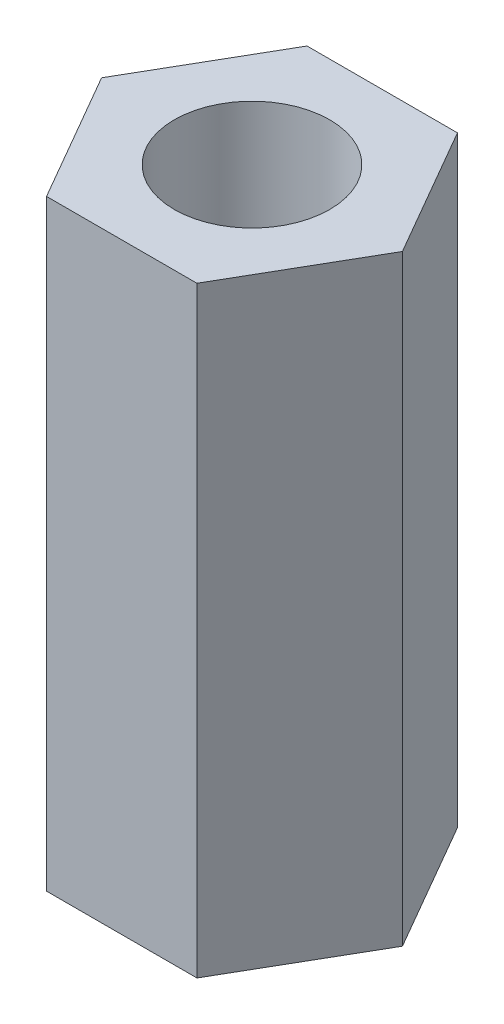
ISO-10303-21;
HEADER;
FILE_DESCRIPTION(('STEP AP214'),'2;1');
FILE_NAME('part.step','',(''),(''),'','','');
FILE_SCHEMA(('AUTOMOTIVE_DESIGN { 1 0 10303 214 1 1 1 1 }'));
ENDSEC;
DATA;
#1=APPLICATION_CONTEXT('core data for automotive mechanical design processes');
#2=APPLICATION_PROTOCOL_DEFINITION('international standard','automotive_design',2000,#1);
#3=PRODUCT_CONTEXT('',#1,'mechanical');
#4=PRODUCT('Part','Part','',(#3));
#5=PRODUCT_RELATED_PRODUCT_CATEGORY('part','',(#4));
#6=PRODUCT_DEFINITION_FORMATION('','',#4);
#7=PRODUCT_DEFINITION_CONTEXT('part definition',#1,'design');
#8=PRODUCT_DEFINITION('design','',#6,#7);
#9=PRODUCT_DEFINITION_SHAPE('','',#8);
#10=(LENGTH_UNIT() NAMED_UNIT(*) SI_UNIT(.MILLI.,.METRE.));
#11=(NAMED_UNIT(*) PLANE_ANGLE_UNIT() SI_UNIT($,.RADIAN.));
#12=(NAMED_UNIT(*) SI_UNIT($,.STERADIAN.) SOLID_ANGLE_UNIT());
#13=UNCERTAINTY_MEASURE_WITH_UNIT(LENGTH_MEASURE(1.E-05),#10,'distance_accuracy_value','');
#14=(GEOMETRIC_REPRESENTATION_CONTEXT(3) GLOBAL_UNCERTAINTY_ASSIGNED_CONTEXT((#13)) GLOBAL_UNIT_ASSIGNED_CONTEXT((#10,
#11,#12)) REPRESENTATION_CONTEXT('',''));
#15=CARTESIAN_POINT('',(0.,0.,0.));
#16=DIRECTION('',(0.,0.,1.));
#17=DIRECTION('',(1.,0.,0.));
#18=AXIS2_PLACEMENT_3D('',#15,#16,#17);
#19=CARTESIAN_POINT('',(1.25000000000002,10.,2.16506350946108));
#20=DIRECTION('',(-0.866025403784442,0.,-0.499999999999995));
#21=DIRECTION('',(-0.499999999999995,0.,0.866025403784442));
#22=AXIS2_PLACEMENT_3D('',#19,#20,#21);
#23=PLANE('',#22);
#24=DIRECTION('',(0.499999999999995,0.,-0.866025403784441));
#25=VECTOR('',#24,1.);
#26=CARTESIAN_POINT('',(1.25000000000002,0.,2.16506350946108));
#27=LINE('',#26,#25);
#28=CARTESIAN_POINT('',(1.25000000000002,0.,2.16506350946108));
#29=VERTEX_POINT('',#28);
#30=CARTESIAN_POINT('',(2.5,0.,0.));
#31=VERTEX_POINT('',#30);
#32=EDGE_CURVE('E116',#29,#31,#27,.T.);
#33=ORIENTED_EDGE('',*,*,#32,.T.);
#34=DIRECTION('',(0.,-1.,0.));
#35=VECTOR('',#34,1.);
#36=CARTESIAN_POINT('',(2.5,10.,0.));
#37=LINE('',#36,#35);
#38=CARTESIAN_POINT('',(2.5,10.,0.));
#39=VERTEX_POINT('',#38);
#40=EDGE_CURVE('E11',#39,#31,#37,.T.);
#41=ORIENTED_EDGE('',*,*,#40,.F.);
#42=DIRECTION('',(0.499999999999995,0.,-0.866025403784441));
#43=VECTOR('',#42,1.);
#44=CARTESIAN_POINT('',(1.25000000000002,10.,2.16506350946108));
#45=LINE('',#44,#43);
#46=CARTESIAN_POINT('',(1.25000000000002,10.,2.16506350946108));
#47=VERTEX_POINT('',#46);
#48=EDGE_CURVE('E127',#47,#39,#45,.T.);
#49=ORIENTED_EDGE('',*,*,#48,.F.);
#50=DIRECTION('',(0.,-1.,0.));
#51=VECTOR('',#50,1.);
#52=CARTESIAN_POINT('',(1.25000000000002,10.,2.16506350946108));
#53=LINE('',#52,#51);
#54=EDGE_CURVE('E112',#47,#29,#53,.T.);
#55=ORIENTED_EDGE('',*,*,#54,.T.);
#56=EDGE_LOOP('',(#33,#41,#49,#55));
#57=FACE_BOUND('',#56,.T.);
#58=ADVANCED_FACE('F32',(#57),#23,.F.);
#59=CARTESIAN_POINT('',(2.5,10.,0.));
#60=DIRECTION('',(-0.866025403784438,0.,0.500000000000001));
#61=DIRECTION('',(0.500000000000001,0.,0.866025403784438));
#62=AXIS2_PLACEMENT_3D('',#59,#60,#61);
#63=PLANE('',#62);
#64=DIRECTION('',(-0.500000000000001,0.,-0.866025403784438));
#65=VECTOR('',#64,1.);
#66=CARTESIAN_POINT('',(2.5,0.,0.));
#67=LINE('',#66,#65);
#68=CARTESIAN_POINT('',(1.24999999999999,0.,-2.1650635094611));
#69=VERTEX_POINT('',#68);
#70=EDGE_CURVE('E119',#31,#69,#67,.T.);
#71=ORIENTED_EDGE('',*,*,#70,.T.);
#72=DIRECTION('',(0.,-1.,0.));
#73=VECTOR('',#72,1.);
#74=CARTESIAN_POINT('',(1.24999999999999,10.,-2.1650635094611));
#75=LINE('',#74,#73);
#76=CARTESIAN_POINT('',(1.24999999999999,10.,-2.1650635094611));
#77=VERTEX_POINT('',#76);
#78=EDGE_CURVE('E40',#77,#69,#75,.T.);
#79=ORIENTED_EDGE('',*,*,#78,.F.);
#80=DIRECTION('',(-0.500000000000001,0.,-0.866025403784438));
#81=VECTOR('',#80,1.);
#82=CARTESIAN_POINT('',(2.5,10.,0.));
#83=LINE('',#82,#81);
#84=EDGE_CURVE('E85',#39,#77,#83,.T.);
#85=ORIENTED_EDGE('',*,*,#84,.F.);
#86=ORIENTED_EDGE('',*,*,#40,.T.);
#87=EDGE_LOOP('',(#71,#79,#85,#86));
#88=FACE_BOUND('',#87,.T.);
#89=ADVANCED_FACE('F152',(#88),#63,.F.);
#90=CARTESIAN_POINT('',(1.24999999999999,10.,-2.1650635094611));
#91=DIRECTION('',(0.,0.,1.));
#92=DIRECTION('',(1.,0.,0.));
#93=AXIS2_PLACEMENT_3D('',#90,#91,#92);
#94=PLANE('',#93);
#95=DIRECTION('',(-1.,0.,0.));
#96=VECTOR('',#95,1.);
#97=CARTESIAN_POINT('',(1.24999999999999,0.,-2.1650635094611));
#98=LINE('',#97,#96);
#99=CARTESIAN_POINT('',(-1.25000000000001,0.,-2.16506350946109));
#100=VERTEX_POINT('',#99);
#101=EDGE_CURVE('E122',#69,#100,#98,.T.);
#102=ORIENTED_EDGE('',*,*,#101,.T.);
#103=DIRECTION('',(0.,-1.,0.));
#104=VECTOR('',#103,1.);
#105=CARTESIAN_POINT('',(-1.25000000000001,10.,-2.16506350946109));
#106=LINE('',#105,#104);
#107=CARTESIAN_POINT('',(-1.25000000000001,10.,-2.16506350946109));
#108=VERTEX_POINT('',#107);
#109=EDGE_CURVE('E107',#108,#100,#106,.T.);
#110=ORIENTED_EDGE('',*,*,#109,.F.);
#111=DIRECTION('',(-1.,0.,0.));
#112=VECTOR('',#111,1.);
#113=CARTESIAN_POINT('',(1.24999999999999,10.,-2.1650635094611));
#114=LINE('',#113,#112);
#115=EDGE_CURVE('E98',#77,#108,#114,.T.);
#116=ORIENTED_EDGE('',*,*,#115,.F.);
#117=ORIENTED_EDGE('',*,*,#78,.T.);
#118=EDGE_LOOP('',(#102,#110,#116,#117));
#119=FACE_BOUND('',#118,.T.);
#120=ADVANCED_FACE('F133',(#119),#94,.F.);
#121=CARTESIAN_POINT('',(-1.25000000000001,10.,-2.16506350946109));
#122=DIRECTION('',(0.866025403784441,0.,0.499999999999995));
#123=DIRECTION('',(0.499999999999995,0.,-0.866025403784441));
#124=AXIS2_PLACEMENT_3D('',#121,#122,#123);
#125=PLANE('',#124);
#126=DIRECTION('',(-0.499999999999995,0.,0.866025403784441));
#127=VECTOR('',#126,1.);
#128=CARTESIAN_POINT('',(-1.25000000000001,0.,-2.16506350946109));
#129=LINE('',#128,#127);
#130=CARTESIAN_POINT('',(-2.5,0.,0.));
#131=VERTEX_POINT('',#130);
#132=EDGE_CURVE('E106',#100,#131,#129,.T.);
#133=ORIENTED_EDGE('',*,*,#132,.T.);
#134=DIRECTION('',(0.,-1.,0.));
#135=VECTOR('',#134,1.);
#136=CARTESIAN_POINT('',(-2.5,10.,0.));
#137=LINE('',#136,#135);
#138=CARTESIAN_POINT('',(-2.5,10.,0.));
#139=VERTEX_POINT('',#138);
#140=EDGE_CURVE('E103',#139,#131,#137,.T.);
#141=ORIENTED_EDGE('',*,*,#140,.F.);
#142=DIRECTION('',(-0.499999999999995,0.,0.866025403784441));
#143=VECTOR('',#142,1.);
#144=CARTESIAN_POINT('',(-1.25000000000001,10.,-2.16506350946109));
#145=LINE('',#144,#143);
#146=EDGE_CURVE('E92',#108,#139,#145,.T.);
#147=ORIENTED_EDGE('',*,*,#146,.F.);
#148=ORIENTED_EDGE('',*,*,#109,.T.);
#149=EDGE_LOOP('',(#133,#141,#147,#148));
#150=FACE_BOUND('',#149,.T.);
#151=ADVANCED_FACE('F104',(#150),#125,.F.);
#152=CARTESIAN_POINT('',(-2.5,10.,0.));
#153=DIRECTION('',(0.866025403784434,0.,-0.500000000000007));
#154=DIRECTION('',(-0.500000000000007,0.,-0.866025403784435));
#155=AXIS2_PLACEMENT_3D('',#152,#153,#154);
#156=PLANE('',#155);
#157=DIRECTION('',(0.500000000000007,0.,0.866025403784434));
#158=VECTOR('',#157,1.);
#159=CARTESIAN_POINT('',(-2.5,0.,0.));
#160=LINE('',#159,#158);
#161=CARTESIAN_POINT('',(-1.24999999999998,0.,2.1650635094611));
#162=VERTEX_POINT('',#161);
#163=EDGE_CURVE('E71',#131,#162,#160,.T.);
#164=ORIENTED_EDGE('',*,*,#163,.T.);
#165=DIRECTION('',(0.,-1.,0.));
#166=VECTOR('',#165,1.);
#167=CARTESIAN_POINT('',(-1.24999999999998,10.,2.1650635094611));
#168=LINE('',#167,#166);
#169=CARTESIAN_POINT('',(-1.24999999999998,10.,2.1650635094611));
#170=VERTEX_POINT('',#169);
#171=EDGE_CURVE('E108',#170,#162,#168,.T.);
#172=ORIENTED_EDGE('',*,*,#171,.F.);
#173=DIRECTION('',(0.500000000000007,0.,0.866025403784434));
#174=VECTOR('',#173,1.);
#175=CARTESIAN_POINT('',(-2.5,10.,0.));
#176=LINE('',#175,#174);
#177=EDGE_CURVE('E96',#139,#170,#176,.T.);
#178=ORIENTED_EDGE('',*,*,#177,.F.);
#179=ORIENTED_EDGE('',*,*,#140,.T.);
#180=EDGE_LOOP('',(#164,#172,#178,#179));
#181=FACE_BOUND('',#180,.T.);
#182=ADVANCED_FACE('F110',(#181),#156,.F.);
#183=CARTESIAN_POINT('',(-1.24999999999998,10.,2.1650635094611));
#184=DIRECTION('',(0.,0.,-1.));
#185=DIRECTION('',(-1.,0.,0.));
#186=AXIS2_PLACEMENT_3D('',#183,#184,#185);
#187=PLANE('',#186);
#188=DIRECTION('',(1.,0.,0.));
#189=VECTOR('',#188,1.);
#190=CARTESIAN_POINT('',(-1.24999999999998,0.,2.1650635094611));
#191=LINE('',#190,#189);
#192=EDGE_CURVE('E77',#162,#29,#191,.T.);
#193=ORIENTED_EDGE('',*,*,#192,.T.);
#194=ORIENTED_EDGE('',*,*,#54,.F.);
#195=DIRECTION('',(1.,0.,0.));
#196=VECTOR('',#195,1.);
#197=CARTESIAN_POINT('',(-1.24999999999998,10.,2.1650635094611));
#198=LINE('',#197,#196);
#199=EDGE_CURVE('E48',#170,#47,#198,.T.);
#200=ORIENTED_EDGE('',*,*,#199,.F.);
#201=ORIENTED_EDGE('',*,*,#171,.T.);
#202=EDGE_LOOP('',(#193,#194,#200,#201));
#203=FACE_BOUND('',#202,.T.);
#204=ADVANCED_FACE('F140',(#203),#187,.F.);
#205=CARTESIAN_POINT('',(0.,10.,0.));
#206=DIRECTION('',(0.,1.,0.));
#207=DIRECTION('',(0.,0.,1.));
#208=AXIS2_PLACEMENT_3D('',#205,#206,#207);
#209=PLANE('',#208);
#210=CARTESIAN_POINT('',(0.,10.,0.));
#211=DIRECTION('',(0.,1.,0.));
#212=DIRECTION('',(0.,0.,1.));
#213=AXIS2_PLACEMENT_3D('',#210,#211,#212);
#214=CIRCLE('',#213,1.29191785356696);
#215=CARTESIAN_POINT('',(0.,10.,1.29191785356696));
#216=VERTEX_POINT('',#215);
#217=EDGE_CURVE('E207',#216,#216,#214,.T.);
#218=ORIENTED_EDGE('',*,*,#217,.F.);
#219=EDGE_LOOP('',(#218));
#220=FACE_BOUND('',#219,.T.);
#221=ORIENTED_EDGE('',*,*,#48,.T.);
#222=ORIENTED_EDGE('',*,*,#84,.T.);
#223=ORIENTED_EDGE('',*,*,#115,.T.);
#224=ORIENTED_EDGE('',*,*,#146,.T.);
#225=ORIENTED_EDGE('',*,*,#177,.T.);
#226=ORIENTED_EDGE('',*,*,#199,.T.);
#227=EDGE_LOOP('',(#221,#222,#223,#224,#225,#226));
#228=FACE_BOUND('',#227,.T.);
#229=ADVANCED_FACE('F94',(#220,#228),#209,.T.);
#230=CARTESIAN_POINT('',(0.,0.,0.));
#231=DIRECTION('',(0.,1.,0.));
#232=DIRECTION('',(0.,0.,1.));
#233=AXIS2_PLACEMENT_3D('',#230,#231,#232);
#234=PLANE('',#233);
#235=CARTESIAN_POINT('',(0.,0.,0.));
#236=DIRECTION('',(0.,1.,0.));
#237=DIRECTION('',(0.,0.,1.));
#238=AXIS2_PLACEMENT_3D('',#235,#236,#237);
#239=CIRCLE('',#238,1.29191785356696);
#240=CARTESIAN_POINT('',(0.,0.,1.29191785356696));
#241=VERTEX_POINT('',#240);
#242=EDGE_CURVE('E120',#241,#241,#239,.T.);
#243=ORIENTED_EDGE('',*,*,#242,.T.);
#244=EDGE_LOOP('',(#243));
#245=FACE_BOUND('',#244,.T.);
#246=ORIENTED_EDGE('',*,*,#32,.F.);
#247=ORIENTED_EDGE('',*,*,#192,.F.);
#248=ORIENTED_EDGE('',*,*,#163,.F.);
#249=ORIENTED_EDGE('',*,*,#132,.F.);
#250=ORIENTED_EDGE('',*,*,#101,.F.);
#251=ORIENTED_EDGE('',*,*,#70,.F.);
#252=EDGE_LOOP('',(#246,#247,#248,#249,#250,#251));
#253=FACE_BOUND('',#252,.T.);
#254=ADVANCED_FACE('F136',(#245,#253),#234,.F.);
#255=CARTESIAN_POINT('',(0.,0.,0.));
#256=DIRECTION('',(0.,1.,0.));
#257=DIRECTION('',(0.,0.,1.));
#258=AXIS2_PLACEMENT_3D('',#255,#256,#257);
#259=CYLINDRICAL_SURFACE('',#258,1.29191785356696);
#260=ORIENTED_EDGE('',*,*,#242,.F.);
#261=EDGE_LOOP('',(#260));
#262=FACE_BOUND('',#261,.T.);
#263=ORIENTED_EDGE('',*,*,#217,.T.);
#264=EDGE_LOOP('',(#263));
#265=FACE_BOUND('',#264,.T.);
#266=ADVANCED_FACE('F189',(#262,#265),#259,.F.);
#267=CLOSED_SHELL('',(#58,#89,#120,#151,#182,#204,#229,#254,#266));
#268=MANIFOLD_SOLID_BREP('B2',#267);
#269=ADVANCED_BREP_SHAPE_REPRESENTATION('',(#18,#268),#14);
#270=SHAPE_DEFINITION_REPRESENTATION(#9,#269);
ENDSEC;
END-ISO-10303-21;
